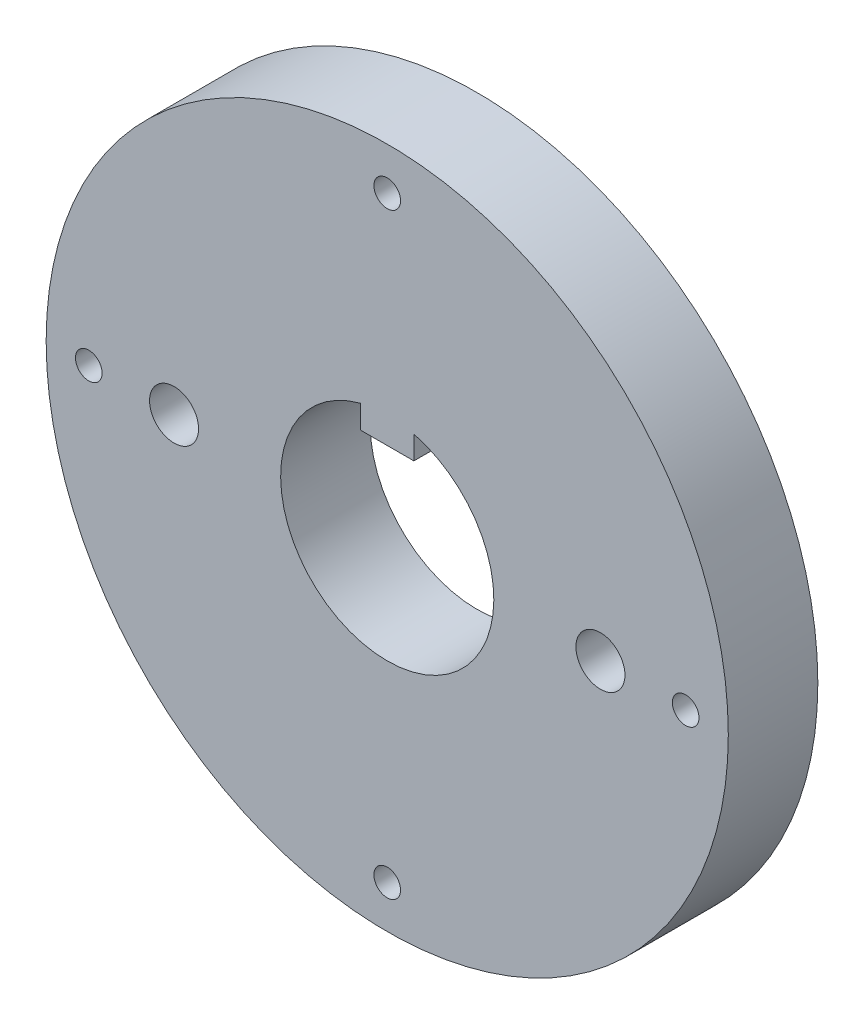
ISO-10303-21;
HEADER;
FILE_DESCRIPTION(('STEP AP214'),'2;1');
FILE_NAME('part.step','',(''),(''),'','','');
FILE_SCHEMA(('AUTOMOTIVE_DESIGN { 1 0 10303 214 1 1 1 1 }'));
ENDSEC;
DATA;
#1=APPLICATION_CONTEXT('core data for automotive mechanical design processes');
#2=APPLICATION_PROTOCOL_DEFINITION('international standard','automotive_design',2000,#1);
#3=PRODUCT_CONTEXT('',#1,'mechanical');
#4=PRODUCT('Part','Part','',(#3));
#5=PRODUCT_RELATED_PRODUCT_CATEGORY('part','',(#4));
#6=PRODUCT_DEFINITION_FORMATION('','',#4);
#7=PRODUCT_DEFINITION_CONTEXT('part definition',#1,'design');
#8=PRODUCT_DEFINITION('design','',#6,#7);
#9=PRODUCT_DEFINITION_SHAPE('','',#8);
#10=(LENGTH_UNIT() NAMED_UNIT(*) SI_UNIT(.MILLI.,.METRE.));
#11=(NAMED_UNIT(*) PLANE_ANGLE_UNIT() SI_UNIT($,.RADIAN.));
#12=(NAMED_UNIT(*) SI_UNIT($,.STERADIAN.) SOLID_ANGLE_UNIT());
#13=UNCERTAINTY_MEASURE_WITH_UNIT(LENGTH_MEASURE(1.E-05),#10,'distance_accuracy_value','');
#14=(GEOMETRIC_REPRESENTATION_CONTEXT(3) GLOBAL_UNCERTAINTY_ASSIGNED_CONTEXT((#13)) GLOBAL_UNIT_ASSIGNED_CONTEXT((#10,
#11,#12)) REPRESENTATION_CONTEXT('',''));
#15=CARTESIAN_POINT('',(0.,0.,0.));
#16=DIRECTION('',(0.,0.,1.));
#17=DIRECTION('',(1.,0.,0.));
#18=AXIS2_PLACEMENT_3D('',#15,#16,#17);
#19=CARTESIAN_POINT('',(0.,0.,2.667));
#20=DIRECTION('',(0.,0.,1.));
#21=DIRECTION('',(1.,0.,0.));
#22=AXIS2_PLACEMENT_3D('',#19,#20,#21);
#23=PLANE('',#22);
#24=CARTESIAN_POINT('',(17.78,0.,2.667));
#25=DIRECTION('',(0.,0.,1.));
#26=DIRECTION('',(1.,0.,0.));
#27=AXIS2_PLACEMENT_3D('',#24,#25,#26);
#28=CIRCLE('',#27,0.793750000000058);
#29=CARTESIAN_POINT('',(18.5737500000001,0.,2.667));
#30=VERTEX_POINT('',#29);
#31=EDGE_CURVE('E190',#30,#30,#28,.T.);
#32=ORIENTED_EDGE('',*,*,#31,.F.);
#33=EDGE_LOOP('',(#32));
#34=FACE_BOUND('',#33,.T.);
#35=CARTESIAN_POINT('',(0.,-17.78,2.667));
#36=DIRECTION('',(0.,0.,1.));
#37=DIRECTION('',(1.,0.,0.));
#38=AXIS2_PLACEMENT_3D('',#35,#36,#37);
#39=CIRCLE('',#38,0.793749999999999);
#40=CARTESIAN_POINT('',(0.793750000000001,-17.78,2.667));
#41=VERTEX_POINT('',#40);
#42=EDGE_CURVE('E196',#41,#41,#39,.T.);
#43=ORIENTED_EDGE('',*,*,#42,.F.);
#44=EDGE_LOOP('',(#43));
#45=FACE_BOUND('',#44,.T.);
#46=CARTESIAN_POINT('',(-17.78,0.,2.667));
#47=DIRECTION('',(0.,0.,1.));
#48=DIRECTION('',(1.,0.,0.));
#49=AXIS2_PLACEMENT_3D('',#46,#47,#48);
#50=CIRCLE('',#49,0.793749999999999);
#51=CARTESIAN_POINT('',(-16.98625,0.,2.667));
#52=VERTEX_POINT('',#51);
#53=EDGE_CURVE('E204',#52,#52,#50,.T.);
#54=ORIENTED_EDGE('',*,*,#53,.F.);
#55=EDGE_LOOP('',(#54));
#56=FACE_BOUND('',#55,.T.);
#57=CARTESIAN_POINT('',(0.,17.78,2.667));
#58=DIRECTION('',(0.,0.,1.));
#59=DIRECTION('',(1.,0.,0.));
#60=AXIS2_PLACEMENT_3D('',#57,#58,#59);
#61=CIRCLE('',#60,0.79375);
#62=CARTESIAN_POINT('',(0.79375,17.78,2.667));
#63=VERTEX_POINT('',#62);
#64=EDGE_CURVE('E193',#63,#63,#61,.T.);
#65=ORIENTED_EDGE('',*,*,#64,.F.);
#66=EDGE_LOOP('',(#65));
#67=FACE_BOUND('',#66,.T.);
#68=CARTESIAN_POINT('',(-12.7,0.,2.667));
#69=DIRECTION('',(0.,0.,1.));
#70=DIRECTION('',(1.,0.,0.));
#71=AXIS2_PLACEMENT_3D('',#68,#69,#70);
#72=CIRCLE('',#71,1.46050000000001);
#73=CARTESIAN_POINT('',(-11.2395,0.,2.667));
#74=VERTEX_POINT('',#73);
#75=EDGE_CURVE('E113',#74,#74,#72,.T.);
#76=ORIENTED_EDGE('',*,*,#75,.F.);
#77=EDGE_LOOP('',(#76));
#78=FACE_BOUND('',#77,.T.);
#79=CARTESIAN_POINT('',(12.7,0.,2.667));
#80=DIRECTION('',(0.,0.,1.));
#81=DIRECTION('',(1.,0.,0.));
#82=AXIS2_PLACEMENT_3D('',#79,#80,#81);
#83=CIRCLE('',#82,1.4605);
#84=CARTESIAN_POINT('',(14.1605,0.,2.667));
#85=VERTEX_POINT('',#84);
#86=EDGE_CURVE('E120',#85,#85,#83,.T.);
#87=ORIENTED_EDGE('',*,*,#86,.F.);
#88=EDGE_LOOP('',(#87));
#89=FACE_BOUND('',#88,.T.);
#90=CARTESIAN_POINT('',(0.,0.,2.667));
#91=DIRECTION('',(0.,0.,1.));
#92=DIRECTION('',(1.,0.,0.));
#93=AXIS2_PLACEMENT_3D('',#90,#91,#92);
#94=CIRCLE('',#93,20.32);
#95=CARTESIAN_POINT('',(20.32,0.,2.667));
#96=VERTEX_POINT('',#95);
#97=EDGE_CURVE('E12',#96,#96,#94,.T.);
#98=ORIENTED_EDGE('',*,*,#97,.T.);
#99=EDGE_LOOP('',(#98));
#100=FACE_BOUND('',#99,.T.);
#101=CARTESIAN_POINT('',(0.,0.,2.667));
#102=DIRECTION('',(0.,0.,1.));
#103=DIRECTION('',(1.,0.,0.));
#104=AXIS2_PLACEMENT_3D('',#101,#102,#103);
#105=CIRCLE('',#104,6.35);
#106=CARTESIAN_POINT('',(-1.5875,6.14836106210427,2.667));
#107=VERTEX_POINT('',#106);
#108=CARTESIAN_POINT('',(1.5875,6.14836106210427,2.667));
#109=VERTEX_POINT('',#108);
#110=EDGE_CURVE('E67',#107,#109,#105,.T.);
#111=ORIENTED_EDGE('',*,*,#110,.F.);
#112=DIRECTION('',(0.,-1.,0.));
#113=VECTOR('',#112,1.);
#114=CARTESIAN_POINT('',(-1.58749999999999,0.,2.667));
#115=LINE('',#114,#113);
#116=CARTESIAN_POINT('',(-1.5875,4.7625,2.667));
#117=VERTEX_POINT('',#116);
#118=EDGE_CURVE('E110',#107,#117,#115,.T.);
#119=ORIENTED_EDGE('',*,*,#118,.T.);
#120=DIRECTION('',(1.,0.,0.));
#121=VECTOR('',#120,1.);
#122=CARTESIAN_POINT('',(0.,4.7625,2.667));
#123=LINE('',#122,#121);
#124=CARTESIAN_POINT('',(1.5875,4.7625,2.667));
#125=VERTEX_POINT('',#124);
#126=EDGE_CURVE('E59',#117,#125,#123,.T.);
#127=ORIENTED_EDGE('',*,*,#126,.T.);
#128=DIRECTION('',(0.,-1.,0.));
#129=VECTOR('',#128,1.);
#130=CARTESIAN_POINT('',(1.5875,0.,2.667));
#131=LINE('',#130,#129);
#132=EDGE_CURVE('E53',#109,#125,#131,.T.);
#133=ORIENTED_EDGE('',*,*,#132,.F.);
#134=EDGE_LOOP('',(#111,#119,#127,#133));
#135=FACE_BOUND('',#134,.T.);
#136=ADVANCED_FACE('F38',(#34,#45,#56,#67,#78,#89,#100,#135),#23,.T.);
#137=CARTESIAN_POINT('',(0.,0.,-2.667));
#138=DIRECTION('',(0.,0.,1.));
#139=DIRECTION('',(1.,0.,0.));
#140=AXIS2_PLACEMENT_3D('',#137,#138,#139);
#141=PLANE('',#140);
#142=CARTESIAN_POINT('',(17.78,0.,-2.667));
#143=DIRECTION('',(0.,0.,1.));
#144=DIRECTION('',(1.,0.,0.));
#145=AXIS2_PLACEMENT_3D('',#142,#143,#144);
#146=CIRCLE('',#145,0.793750000000058);
#147=CARTESIAN_POINT('',(18.5737500000001,0.,-2.667));
#148=VERTEX_POINT('',#147);
#149=EDGE_CURVE('E187',#148,#148,#146,.T.);
#150=ORIENTED_EDGE('',*,*,#149,.T.);
#151=EDGE_LOOP('',(#150));
#152=FACE_BOUND('',#151,.T.);
#153=CARTESIAN_POINT('',(0.,-17.78,-2.667));
#154=DIRECTION('',(0.,0.,1.));
#155=DIRECTION('',(1.,0.,0.));
#156=AXIS2_PLACEMENT_3D('',#153,#154,#155);
#157=CIRCLE('',#156,0.793749999999999);
#158=CARTESIAN_POINT('',(0.793750000000001,-17.78,-2.667));
#159=VERTEX_POINT('',#158);
#160=EDGE_CURVE('E191',#159,#159,#157,.T.);
#161=ORIENTED_EDGE('',*,*,#160,.T.);
#162=EDGE_LOOP('',(#161));
#163=FACE_BOUND('',#162,.T.);
#164=CARTESIAN_POINT('',(-17.78,0.,-2.667));
#165=DIRECTION('',(0.,0.,1.));
#166=DIRECTION('',(1.,0.,0.));
#167=AXIS2_PLACEMENT_3D('',#164,#165,#166);
#168=CIRCLE('',#167,0.793749999999999);
#169=CARTESIAN_POINT('',(-16.98625,0.,-2.667));
#170=VERTEX_POINT('',#169);
#171=EDGE_CURVE('E201',#170,#170,#168,.T.);
#172=ORIENTED_EDGE('',*,*,#171,.T.);
#173=EDGE_LOOP('',(#172));
#174=FACE_BOUND('',#173,.T.);
#175=CARTESIAN_POINT('',(0.,17.78,-2.667));
#176=DIRECTION('',(0.,0.,1.));
#177=DIRECTION('',(1.,0.,0.));
#178=AXIS2_PLACEMENT_3D('',#175,#176,#177);
#179=CIRCLE('',#178,0.79375);
#180=CARTESIAN_POINT('',(0.79375,17.78,-2.667));
#181=VERTEX_POINT('',#180);
#182=EDGE_CURVE('E207',#181,#181,#179,.T.);
#183=ORIENTED_EDGE('',*,*,#182,.T.);
#184=EDGE_LOOP('',(#183));
#185=FACE_BOUND('',#184,.T.);
#186=CARTESIAN_POINT('',(-12.7,0.,-2.667));
#187=DIRECTION('',(0.,0.,1.));
#188=DIRECTION('',(1.,0.,0.));
#189=AXIS2_PLACEMENT_3D('',#186,#187,#188);
#190=CIRCLE('',#189,1.46050000000001);
#191=CARTESIAN_POINT('',(-11.2395,0.,-2.667));
#192=VERTEX_POINT('',#191);
#193=EDGE_CURVE('E117',#192,#192,#190,.T.);
#194=ORIENTED_EDGE('',*,*,#193,.T.);
#195=EDGE_LOOP('',(#194));
#196=FACE_BOUND('',#195,.T.);
#197=CARTESIAN_POINT('',(12.7,0.,-2.667));
#198=DIRECTION('',(0.,0.,1.));
#199=DIRECTION('',(1.,0.,0.));
#200=AXIS2_PLACEMENT_3D('',#197,#198,#199);
#201=CIRCLE('',#200,1.4605);
#202=CARTESIAN_POINT('',(14.1605,0.,-2.667));
#203=VERTEX_POINT('',#202);
#204=EDGE_CURVE('E123',#203,#203,#201,.T.);
#205=ORIENTED_EDGE('',*,*,#204,.T.);
#206=EDGE_LOOP('',(#205));
#207=FACE_BOUND('',#206,.T.);
#208=CARTESIAN_POINT('',(0.,0.,-2.667));
#209=DIRECTION('',(0.,0.,1.));
#210=DIRECTION('',(1.,0.,0.));
#211=AXIS2_PLACEMENT_3D('',#208,#209,#210);
#212=CIRCLE('',#211,20.32);
#213=CARTESIAN_POINT('',(20.32,0.,-2.667));
#214=VERTEX_POINT('',#213);
#215=EDGE_CURVE('E42',#214,#214,#212,.T.);
#216=ORIENTED_EDGE('',*,*,#215,.F.);
#217=EDGE_LOOP('',(#216));
#218=FACE_BOUND('',#217,.T.);
#219=DIRECTION('',(0.,1.,0.));
#220=VECTOR('',#219,1.);
#221=CARTESIAN_POINT('',(1.5875,0.,-2.667));
#222=LINE('',#221,#220);
#223=CARTESIAN_POINT('',(1.5875,4.7625,-2.667));
#224=VERTEX_POINT('',#223);
#225=CARTESIAN_POINT('',(1.5875,6.14836106210427,-2.667));
#226=VERTEX_POINT('',#225);
#227=EDGE_CURVE('E102',#224,#226,#222,.T.);
#228=ORIENTED_EDGE('',*,*,#227,.F.);
#229=DIRECTION('',(-1.,0.,0.));
#230=VECTOR('',#229,1.);
#231=CARTESIAN_POINT('',(0.,4.7625,-2.667));
#232=LINE('',#231,#230);
#233=CARTESIAN_POINT('',(-1.5875,4.7625,-2.667));
#234=VERTEX_POINT('',#233);
#235=EDGE_CURVE('E92',#224,#234,#232,.T.);
#236=ORIENTED_EDGE('',*,*,#235,.T.);
#237=DIRECTION('',(0.,1.,0.));
#238=VECTOR('',#237,1.);
#239=CARTESIAN_POINT('',(-1.58749999999999,0.,-2.667));
#240=LINE('',#239,#238);
#241=CARTESIAN_POINT('',(-1.5875,6.14836106210427,-2.667));
#242=VERTEX_POINT('',#241);
#243=EDGE_CURVE('E101',#234,#242,#240,.T.);
#244=ORIENTED_EDGE('',*,*,#243,.T.);
#245=CARTESIAN_POINT('',(0.,0.,-2.667));
#246=DIRECTION('',(0.,0.,1.));
#247=DIRECTION('',(1.,0.,0.));
#248=AXIS2_PLACEMENT_3D('',#245,#246,#247);
#249=CIRCLE('',#248,6.35);
#250=EDGE_CURVE('E210',#226,#242,#249,.F.);
#251=ORIENTED_EDGE('',*,*,#250,.F.);
#252=EDGE_LOOP('',(#228,#236,#244,#251));
#253=FACE_BOUND('',#252,.T.);
#254=ADVANCED_FACE('F100',(#152,#163,#174,#185,#196,#207,#218,#253),#141,.F.);
#255=CARTESIAN_POINT('',(0.,0.,2.667));
#256=DIRECTION('',(0.,0.,-1.));
#257=DIRECTION('',(-1.,0.,0.));
#258=AXIS2_PLACEMENT_3D('',#255,#256,#257);
#259=CYLINDRICAL_SURFACE('',#258,20.32);
#260=ORIENTED_EDGE('',*,*,#97,.F.);
#261=EDGE_LOOP('',(#260));
#262=FACE_BOUND('',#261,.T.);
#263=ORIENTED_EDGE('',*,*,#215,.T.);
#264=EDGE_LOOP('',(#263));
#265=FACE_BOUND('',#264,.T.);
#266=ADVANCED_FACE('F40',(#262,#265),#259,.T.);
#267=CARTESIAN_POINT('',(12.7,0.,-2.667));
#268=DIRECTION('',(0.,0.,1.));
#269=DIRECTION('',(1.,0.,0.));
#270=AXIS2_PLACEMENT_3D('',#267,#268,#269);
#271=CYLINDRICAL_SURFACE('',#270,1.4605);
#272=ORIENTED_EDGE('',*,*,#204,.F.);
#273=EDGE_LOOP('',(#272));
#274=FACE_BOUND('',#273,.T.);
#275=ORIENTED_EDGE('',*,*,#86,.T.);
#276=EDGE_LOOP('',(#275));
#277=FACE_BOUND('',#276,.T.);
#278=ADVANCED_FACE('F131',(#274,#277),#271,.F.);
#279=CARTESIAN_POINT('',(-12.7,0.,-2.667));
#280=DIRECTION('',(0.,0.,1.));
#281=DIRECTION('',(1.,0.,0.));
#282=AXIS2_PLACEMENT_3D('',#279,#280,#281);
#283=CYLINDRICAL_SURFACE('',#282,1.46050000000001);
#284=ORIENTED_EDGE('',*,*,#193,.F.);
#285=EDGE_LOOP('',(#284));
#286=FACE_BOUND('',#285,.T.);
#287=ORIENTED_EDGE('',*,*,#75,.T.);
#288=EDGE_LOOP('',(#287));
#289=FACE_BOUND('',#288,.T.);
#290=ADVANCED_FACE('F153',(#286,#289),#283,.F.);
#291=CARTESIAN_POINT('',(0.,0.,29.6077683632075));
#292=DIRECTION('',(0.,0.,-1.));
#293=DIRECTION('',(-1.,0.,0.));
#294=AXIS2_PLACEMENT_3D('',#291,#292,#293);
#295=CYLINDRICAL_SURFACE('',#294,6.35);
#296=DIRECTION('',(0.,0.,-1.));
#297=VECTOR('',#296,1.);
#298=CARTESIAN_POINT('',(-1.5875,6.14836106210427,29.6077683632075));
#299=LINE('',#298,#297);
#300=EDGE_CURVE('E96',#107,#242,#299,.T.);
#301=ORIENTED_EDGE('',*,*,#300,.F.);
#302=ORIENTED_EDGE('',*,*,#110,.T.);
#303=DIRECTION('',(0.,0.,-1.));
#304=VECTOR('',#303,1.);
#305=CARTESIAN_POINT('',(1.5875,6.14836106210427,29.6077683632075));
#306=LINE('',#305,#304);
#307=EDGE_CURVE('E74',#109,#226,#306,.T.);
#308=ORIENTED_EDGE('',*,*,#307,.T.);
#309=ORIENTED_EDGE('',*,*,#250,.T.);
#310=EDGE_LOOP('',(#301,#302,#308,#309));
#311=FACE_BOUND('',#310,.T.);
#312=ADVANCED_FACE('F157',(#311),#295,.F.);
#313=CARTESIAN_POINT('',(-1.58749999999999,0.,29.6077683632075));
#314=DIRECTION('',(1.,0.,0.));
#315=DIRECTION('',(0.,1.,0.));
#316=AXIS2_PLACEMENT_3D('',#313,#314,#315);
#317=PLANE('',#316);
#318=ORIENTED_EDGE('',*,*,#118,.F.);
#319=ORIENTED_EDGE('',*,*,#300,.T.);
#320=ORIENTED_EDGE('',*,*,#243,.F.);
#321=DIRECTION('',(0.,0.,-1.));
#322=VECTOR('',#321,1.);
#323=CARTESIAN_POINT('',(-1.5875,4.7625,29.6077683632075));
#324=LINE('',#323,#322);
#325=EDGE_CURVE('E89',#117,#234,#324,.T.);
#326=ORIENTED_EDGE('',*,*,#325,.F.);
#327=EDGE_LOOP('',(#318,#319,#320,#326));
#328=FACE_BOUND('',#327,.T.);
#329=ADVANCED_FACE('F104',(#328),#317,.F.);
#330=CARTESIAN_POINT('',(0.,4.7625,29.6077683632075));
#331=DIRECTION('',(0.,1.,0.));
#332=DIRECTION('',(0.,0.,1.));
#333=AXIS2_PLACEMENT_3D('',#330,#331,#332);
#334=PLANE('',#333);
#335=ORIENTED_EDGE('',*,*,#126,.F.);
#336=ORIENTED_EDGE('',*,*,#325,.T.);
#337=ORIENTED_EDGE('',*,*,#235,.F.);
#338=DIRECTION('',(0.,0.,-1.));
#339=VECTOR('',#338,1.);
#340=CARTESIAN_POINT('',(1.5875,4.7625,29.6077683632075));
#341=LINE('',#340,#339);
#342=EDGE_CURVE('E83',#125,#224,#341,.T.);
#343=ORIENTED_EDGE('',*,*,#342,.F.);
#344=EDGE_LOOP('',(#335,#336,#337,#343));
#345=FACE_BOUND('',#344,.T.);
#346=ADVANCED_FACE('F91',(#345),#334,.F.);
#347=CARTESIAN_POINT('',(1.5875,0.,29.6077683632075));
#348=DIRECTION('',(1.,0.,0.));
#349=DIRECTION('',(0.,1.,0.));
#350=AXIS2_PLACEMENT_3D('',#347,#348,#349);
#351=PLANE('',#350);
#352=ORIENTED_EDGE('',*,*,#307,.F.);
#353=ORIENTED_EDGE('',*,*,#132,.T.);
#354=ORIENTED_EDGE('',*,*,#342,.T.);
#355=ORIENTED_EDGE('',*,*,#227,.T.);
#356=EDGE_LOOP('',(#352,#353,#354,#355));
#357=FACE_BOUND('',#356,.T.);
#358=ADVANCED_FACE('F165',(#357),#351,.T.);
#359=CARTESIAN_POINT('',(0.,17.78,-2.667));
#360=DIRECTION('',(0.,0.,1.));
#361=DIRECTION('',(1.,0.,0.));
#362=AXIS2_PLACEMENT_3D('',#359,#360,#361);
#363=CYLINDRICAL_SURFACE('',#362,0.79375);
#364=ORIENTED_EDGE('',*,*,#182,.F.);
#365=EDGE_LOOP('',(#364));
#366=FACE_BOUND('',#365,.T.);
#367=ORIENTED_EDGE('',*,*,#64,.T.);
#368=EDGE_LOOP('',(#367));
#369=FACE_BOUND('',#368,.T.);
#370=ADVANCED_FACE('F168',(#366,#369),#363,.F.);
#371=CARTESIAN_POINT('',(-17.78,0.,-2.667));
#372=DIRECTION('',(0.,0.,1.));
#373=DIRECTION('',(1.,0.,0.));
#374=AXIS2_PLACEMENT_3D('',#371,#372,#373);
#375=CYLINDRICAL_SURFACE('',#374,0.793749999999999);
#376=ORIENTED_EDGE('',*,*,#171,.F.);
#377=EDGE_LOOP('',(#376));
#378=FACE_BOUND('',#377,.T.);
#379=ORIENTED_EDGE('',*,*,#53,.T.);
#380=EDGE_LOOP('',(#379));
#381=FACE_BOUND('',#380,.T.);
#382=ADVANCED_FACE('F171',(#378,#381),#375,.F.);
#383=CARTESIAN_POINT('',(0.,-17.78,-2.667));
#384=DIRECTION('',(0.,0.,1.));
#385=DIRECTION('',(1.,0.,0.));
#386=AXIS2_PLACEMENT_3D('',#383,#384,#385);
#387=CYLINDRICAL_SURFACE('',#386,0.793749999999999);
#388=ORIENTED_EDGE('',*,*,#160,.F.);
#389=EDGE_LOOP('',(#388));
#390=FACE_BOUND('',#389,.T.);
#391=ORIENTED_EDGE('',*,*,#42,.T.);
#392=EDGE_LOOP('',(#391));
#393=FACE_BOUND('',#392,.T.);
#394=ADVANCED_FACE('F175',(#390,#393),#387,.F.);
#395=CARTESIAN_POINT('',(17.78,0.,-2.667));
#396=DIRECTION('',(0.,0.,1.));
#397=DIRECTION('',(1.,0.,0.));
#398=AXIS2_PLACEMENT_3D('',#395,#396,#397);
#399=CYLINDRICAL_SURFACE('',#398,0.793750000000058);
#400=ORIENTED_EDGE('',*,*,#149,.F.);
#401=EDGE_LOOP('',(#400));
#402=FACE_BOUND('',#401,.T.);
#403=ORIENTED_EDGE('',*,*,#31,.T.);
#404=EDGE_LOOP('',(#403));
#405=FACE_BOUND('',#404,.T.);
#406=ADVANCED_FACE('F179',(#402,#405),#399,.F.);
#407=CLOSED_SHELL('',(#136,#254,#266,#278,#290,#312,#329,#346,#358,#370,#382,#394,#406));
#408=MANIFOLD_SOLID_BREP('B2',#407);
#409=ADVANCED_BREP_SHAPE_REPRESENTATION('',(#18,#408),#14);
#410=SHAPE_DEFINITION_REPRESENTATION(#9,#409);
ENDSEC;
END-ISO-10303-21;
